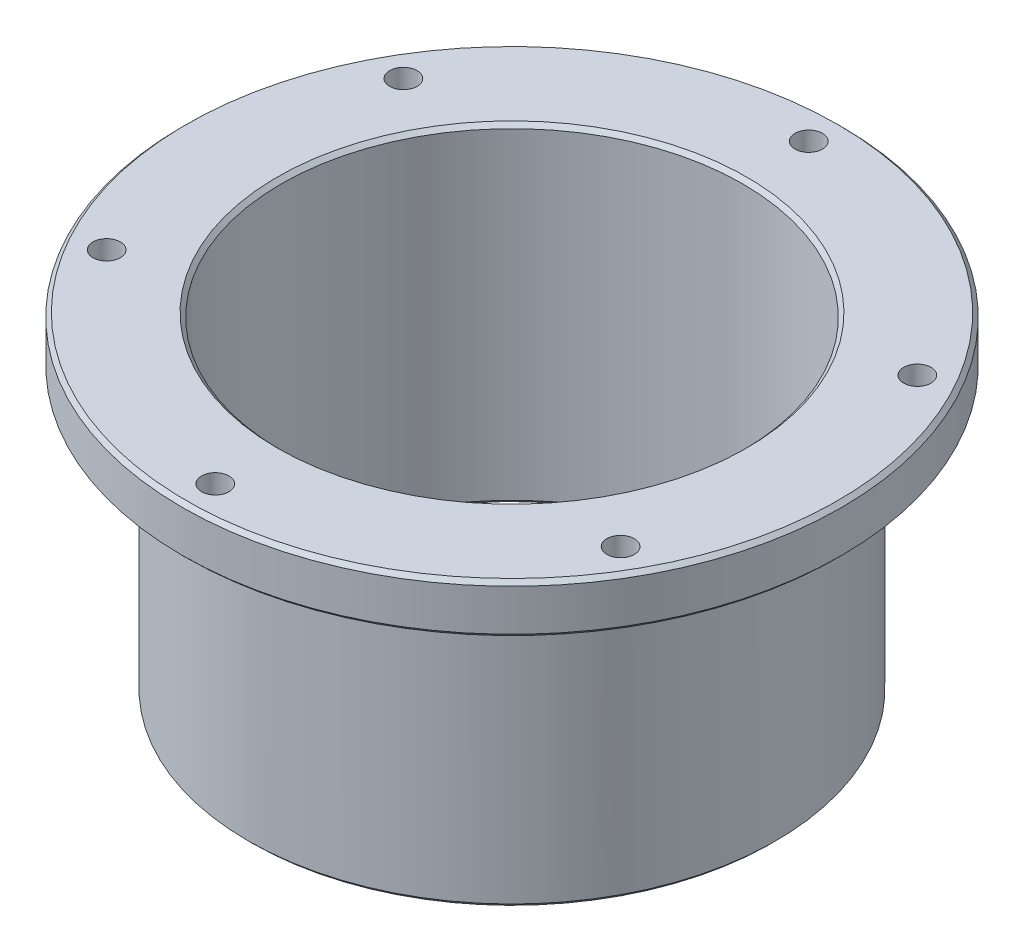
ISO-10303-21;
HEADER;
FILE_DESCRIPTION(('STEP AP214'),'2;1');
FILE_NAME('part.step','',(''),(''),'','','');
FILE_SCHEMA(('AUTOMOTIVE_DESIGN { 1 0 10303 214 1 1 1 1 }'));
ENDSEC;
DATA;
#1=APPLICATION_CONTEXT('core data for automotive mechanical design processes');
#2=APPLICATION_PROTOCOL_DEFINITION('international standard','automotive_design',2000,#1);
#3=PRODUCT_CONTEXT('',#1,'mechanical');
#4=PRODUCT('Part','Part','',(#3));
#5=PRODUCT_RELATED_PRODUCT_CATEGORY('part','',(#4));
#6=PRODUCT_DEFINITION_FORMATION('','',#4);
#7=PRODUCT_DEFINITION_CONTEXT('part definition',#1,'design');
#8=PRODUCT_DEFINITION('design','',#6,#7);
#9=PRODUCT_DEFINITION_SHAPE('','',#8);
#10=(LENGTH_UNIT() NAMED_UNIT(*) SI_UNIT(.MILLI.,.METRE.));
#11=(NAMED_UNIT(*) PLANE_ANGLE_UNIT() SI_UNIT($,.RADIAN.));
#12=(NAMED_UNIT(*) SI_UNIT($,.STERADIAN.) SOLID_ANGLE_UNIT());
#13=UNCERTAINTY_MEASURE_WITH_UNIT(LENGTH_MEASURE(1.E-05),#10,'distance_accuracy_value','');
#14=(GEOMETRIC_REPRESENTATION_CONTEXT(3) GLOBAL_UNCERTAINTY_ASSIGNED_CONTEXT((#13)) GLOBAL_UNIT_ASSIGNED_CONTEXT((#10,
#11,#12)) REPRESENTATION_CONTEXT('',''));
#15=CARTESIAN_POINT('',(0.,0.,0.));
#16=DIRECTION('',(0.,0.,1.));
#17=DIRECTION('',(1.,0.,0.));
#18=AXIS2_PLACEMENT_3D('',#15,#16,#17);
#19=CARTESIAN_POINT('',(-12.5758773367656,27.3684999999995,0.));
#20=DIRECTION('',(0.,1.,0.));
#21=DIRECTION('',(0.,0.,1.));
#22=AXIS2_PLACEMENT_3D('',#19,#20,#21);
#23=CONICAL_SURFACE('',#22,31.7500000000004,0.785398163399998);
#24=CARTESIAN_POINT('',(-12.5758773367656,27.3685,0.));
#25=DIRECTION('',(0.,-1.,0.));
#26=DIRECTION('',(0.,0.,-1.));
#27=AXIS2_PLACEMENT_3D('',#24,#25,#26);
#28=CIRCLE('',#27,31.75);
#29=CARTESIAN_POINT('',(-12.5758773367656,27.3685,-31.75));
#30=VERTEX_POINT('',#29);
#31=EDGE_CURVE('E50',#30,#30,#28,.F.);
#32=ORIENTED_EDGE('',*,*,#31,.F.);
#33=EDGE_LOOP('',(#32));
#34=FACE_BOUND('',#33,.T.);
#35=CARTESIAN_POINT('',(-12.5758773367656,26.9875000000004,0.));
#36=DIRECTION('',(0.,1.,0.));
#37=DIRECTION('',(0.,0.,1.));
#38=AXIS2_PLACEMENT_3D('',#35,#36,#37);
#39=CIRCLE('',#38,31.3689999999995);
#40=CARTESIAN_POINT('',(-12.5758773367656,26.9875000000004,31.3689999999995));
#41=VERTEX_POINT('',#40);
#42=EDGE_CURVE('E18',#41,#41,#39,.T.);
#43=ORIENTED_EDGE('',*,*,#42,.T.);
#44=EDGE_LOOP('',(#43));
#45=FACE_BOUND('',#44,.T.);
#46=ADVANCED_FACE('F15',(#34,#45),#23,.T.);
#47=CARTESIAN_POINT('',(-12.5758773367656,26.7335,0.));
#48=DIRECTION('',(0.,-1.,0.));
#49=DIRECTION('',(0.,0.,-1.));
#50=AXIS2_PLACEMENT_3D('',#47,#48,#49);
#51=TOROIDAL_SURFACE('',#50,25.654,0.254);
#52=CARTESIAN_POINT('',(-12.5758773367656,26.7335,0.));
#53=DIRECTION('',(0.,1.,0.));
#54=DIRECTION('',(0.,0.,1.));
#55=AXIS2_PLACEMENT_3D('',#52,#53,#54);
#56=CIRCLE('',#55,25.4);
#57=CARTESIAN_POINT('',(-12.5758773367656,26.7335,25.4));
#58=VERTEX_POINT('',#57);
#59=EDGE_CURVE('E46',#58,#58,#56,.F.);
#60=ORIENTED_EDGE('',*,*,#59,.F.);
#61=EDGE_LOOP('',(#60));
#62=FACE_BOUND('',#61,.T.);
#63=CARTESIAN_POINT('',(-12.5758773367656,26.9875,0.));
#64=DIRECTION('',(0.,-1.,0.));
#65=DIRECTION('',(1.,0.,0.));
#66=AXIS2_PLACEMENT_3D('',#63,#64,#65);
#67=CIRCLE('',#66,25.654);
#68=CARTESIAN_POINT('',(13.0781226632344,26.9875,0.));
#69=VERTEX_POINT('',#68);
#70=EDGE_CURVE('E55',#69,#69,#67,.T.);
#71=ORIENTED_EDGE('',*,*,#70,.T.);
#72=EDGE_LOOP('',(#71));
#73=FACE_BOUND('',#72,.T.);
#74=ADVANCED_FACE('F78',(#62,#73),#51,.F.);
#75=CARTESIAN_POINT('',(-12.5758773367656,26.9875,0.));
#76=DIRECTION('',(0.,1.,0.));
#77=DIRECTION('',(0.,0.,1.));
#78=AXIS2_PLACEMENT_3D('',#75,#76,#77);
#79=PLANE('',#78);
#80=ORIENTED_EDGE('',*,*,#70,.F.);
#81=EDGE_LOOP('',(#80));
#82=FACE_BOUND('',#81,.T.);
#83=ORIENTED_EDGE('',*,*,#42,.F.);
#84=EDGE_LOOP('',(#83));
#85=FACE_BOUND('',#84,.T.);
#86=CARTESIAN_POINT('',(-12.5758773367656,26.9875,-28.575));
#87=DIRECTION('',(0.,1.,0.));
#88=DIRECTION('',(0.,0.,1.));
#89=AXIS2_PLACEMENT_3D('',#86,#87,#88);
#90=CIRCLE('',#89,1.3208);
#91=CARTESIAN_POINT('',(-12.5758773367656,26.9875,-27.2542));
#92=VERTEX_POINT('',#91);
#93=EDGE_CURVE('E43',#92,#92,#90,.T.);
#94=ORIENTED_EDGE('',*,*,#93,.T.);
#95=EDGE_LOOP('',(#94));
#96=FACE_BOUND('',#95,.T.);
#97=CARTESIAN_POINT('',(12.1707985763747,26.9875,-14.2875));
#98=DIRECTION('',(0.,1.,0.));
#99=DIRECTION('',(0.,0.,1.));
#100=AXIS2_PLACEMENT_3D('',#97,#98,#99);
#101=CIRCLE('',#100,1.3208);
#102=CARTESIAN_POINT('',(12.1707985763747,26.9875,-12.9667));
#103=VERTEX_POINT('',#102);
#104=EDGE_CURVE('E122',#103,#103,#101,.T.);
#105=ORIENTED_EDGE('',*,*,#104,.T.);
#106=EDGE_LOOP('',(#105));
#107=FACE_BOUND('',#106,.T.);
#108=CARTESIAN_POINT('',(12.1707985763747,26.9875,14.2875));
#109=DIRECTION('',(0.,1.,0.));
#110=DIRECTION('',(0.,0.,1.));
#111=AXIS2_PLACEMENT_3D('',#108,#109,#110);
#112=CIRCLE('',#111,1.3208);
#113=CARTESIAN_POINT('',(12.1707985763747,26.9875,15.6083));
#114=VERTEX_POINT('',#113);
#115=EDGE_CURVE('E125',#114,#114,#112,.T.);
#116=ORIENTED_EDGE('',*,*,#115,.T.);
#117=EDGE_LOOP('',(#116));
#118=FACE_BOUND('',#117,.T.);
#119=CARTESIAN_POINT('',(-12.5758773367656,26.9875,28.575));
#120=DIRECTION('',(0.,1.,0.));
#121=DIRECTION('',(0.,0.,1.));
#122=AXIS2_PLACEMENT_3D('',#119,#120,#121);
#123=CIRCLE('',#122,1.3208);
#124=CARTESIAN_POINT('',(-12.5758773367656,26.9875,29.8958));
#125=VERTEX_POINT('',#124);
#126=EDGE_CURVE('E128',#125,#125,#123,.T.);
#127=ORIENTED_EDGE('',*,*,#126,.T.);
#128=EDGE_LOOP('',(#127));
#129=FACE_BOUND('',#128,.T.);
#130=CARTESIAN_POINT('',(-37.322553249906,26.9875,14.2875));
#131=DIRECTION('',(0.,1.,0.));
#132=DIRECTION('',(0.,0.,1.));
#133=AXIS2_PLACEMENT_3D('',#130,#131,#132);
#134=CIRCLE('',#133,1.3208);
#135=CARTESIAN_POINT('',(-37.322553249906,26.9875,15.6083));
#136=VERTEX_POINT('',#135);
#137=EDGE_CURVE('E131',#136,#136,#134,.T.);
#138=ORIENTED_EDGE('',*,*,#137,.T.);
#139=EDGE_LOOP('',(#138));
#140=FACE_BOUND('',#139,.T.);
#141=CARTESIAN_POINT('',(-37.322553249906,26.9875,-14.2875));
#142=DIRECTION('',(0.,1.,0.));
#143=DIRECTION('',(0.,0.,1.));
#144=AXIS2_PLACEMENT_3D('',#141,#142,#143);
#145=CIRCLE('',#144,1.3208);
#146=CARTESIAN_POINT('',(-37.322553249906,26.9875,-12.9667));
#147=VERTEX_POINT('',#146);
#148=EDGE_CURVE('E49',#147,#147,#145,.T.);
#149=ORIENTED_EDGE('',*,*,#148,.T.);
#150=EDGE_LOOP('',(#149));
#151=FACE_BOUND('',#150,.T.);
#152=ADVANCED_FACE('F68',(#82,#85,#96,#107,#118,#129,#140,#151),#79,.F.);
#153=CARTESIAN_POINT('',(-12.5758773367656,15.875,0.));
#154=DIRECTION('',(0.,-1.,0.));
#155=DIRECTION('',(0.,0.,-1.));
#156=AXIS2_PLACEMENT_3D('',#153,#154,#155);
#157=CYLINDRICAL_SURFACE('',#156,31.75);
#158=ORIENTED_EDGE('',*,*,#31,.T.);
#159=EDGE_LOOP('',(#158));
#160=FACE_BOUND('',#159,.T.);
#161=CARTESIAN_POINT('',(-12.5758773367656,31.3690000000005,0.));
#162=DIRECTION('',(0.,-1.,0.));
#163=DIRECTION('',(-1.,0.,0.));
#164=AXIS2_PLACEMENT_3D('',#161,#162,#163);
#165=CIRCLE('',#164,31.7500000000005);
#166=CARTESIAN_POINT('',(-44.3258773367661,31.3690000000005,0.));
#167=VERTEX_POINT('',#166);
#168=EDGE_CURVE('E38',#167,#167,#165,.F.);
#169=ORIENTED_EDGE('',*,*,#168,.F.);
#170=EDGE_LOOP('',(#169));
#171=FACE_BOUND('',#170,.T.);
#172=ADVANCED_FACE('F77',(#160,#171),#157,.T.);
#173=CARTESIAN_POINT('',(-12.5758773367656,0.,0.));
#174=DIRECTION('',(0.,1.,0.));
#175=DIRECTION('',(0.,0.,1.));
#176=AXIS2_PLACEMENT_3D('',#173,#174,#175);
#177=CYLINDRICAL_SURFACE('',#176,25.4);
#178=ORIENTED_EDGE('',*,*,#59,.T.);
#179=EDGE_LOOP('',(#178));
#180=FACE_BOUND('',#179,.T.);
#181=CARTESIAN_POINT('',(-12.5758773367656,0.380999999999514,0.));
#182=DIRECTION('',(0.,1.,0.));
#183=DIRECTION('',(-1.,0.,0.));
#184=AXIS2_PLACEMENT_3D('',#181,#182,#183);
#185=CIRCLE('',#184,25.4000000000005);
#186=CARTESIAN_POINT('',(-37.9758773367661,0.380999999999514,0.));
#187=VERTEX_POINT('',#186);
#188=EDGE_CURVE('E34',#187,#187,#185,.F.);
#189=ORIENTED_EDGE('',*,*,#188,.F.);
#190=EDGE_LOOP('',(#189));
#191=FACE_BOUND('',#190,.T.);
#192=ADVANCED_FACE('F140',(#180,#191),#177,.T.);
#193=CARTESIAN_POINT('',(-37.322553249906,-63.5,-14.2875));
#194=DIRECTION('',(0.,1.,0.));
#195=DIRECTION('',(0.,0.,1.));
#196=AXIS2_PLACEMENT_3D('',#193,#194,#195);
#197=CYLINDRICAL_SURFACE('',#196,1.3208);
#198=CARTESIAN_POINT('',(-37.322553249906,31.75,-14.2875));
#199=DIRECTION('',(0.,1.,0.));
#200=DIRECTION('',(0.,0.,1.));
#201=AXIS2_PLACEMENT_3D('',#198,#199,#200);
#202=CIRCLE('',#201,1.3208);
#203=CARTESIAN_POINT('',(-37.322553249906,31.75,-12.9667));
#204=VERTEX_POINT('',#203);
#205=EDGE_CURVE('E37',#204,#204,#202,.F.);
#206=ORIENTED_EDGE('',*,*,#205,.F.);
#207=EDGE_LOOP('',(#206));
#208=FACE_BOUND('',#207,.T.);
#209=ORIENTED_EDGE('',*,*,#148,.F.);
#210=EDGE_LOOP('',(#209));
#211=FACE_BOUND('',#210,.T.);
#212=ADVANCED_FACE('F137',(#208,#211),#197,.F.);
#213=CARTESIAN_POINT('',(-37.322553249906,-63.5,14.2875));
#214=DIRECTION('',(0.,1.,0.));
#215=DIRECTION('',(0.,0.,1.));
#216=AXIS2_PLACEMENT_3D('',#213,#214,#215);
#217=CYLINDRICAL_SURFACE('',#216,1.3208);
#218=CARTESIAN_POINT('',(-37.322553249906,31.75,14.2875));
#219=DIRECTION('',(0.,1.,0.));
#220=DIRECTION('',(0.,0.,1.));
#221=AXIS2_PLACEMENT_3D('',#218,#219,#220);
#222=CIRCLE('',#221,1.3208);
#223=CARTESIAN_POINT('',(-37.322553249906,31.75,15.6083));
#224=VERTEX_POINT('',#223);
#225=EDGE_CURVE('E115',#224,#224,#222,.F.);
#226=ORIENTED_EDGE('',*,*,#225,.F.);
#227=EDGE_LOOP('',(#226));
#228=FACE_BOUND('',#227,.T.);
#229=ORIENTED_EDGE('',*,*,#137,.F.);
#230=EDGE_LOOP('',(#229));
#231=FACE_BOUND('',#230,.T.);
#232=ADVANCED_FACE('F139',(#228,#231),#217,.F.);
#233=CARTESIAN_POINT('',(-12.5758773367656,-63.5,28.575));
#234=DIRECTION('',(0.,1.,0.));
#235=DIRECTION('',(0.,0.,1.));
#236=AXIS2_PLACEMENT_3D('',#233,#234,#235);
#237=CYLINDRICAL_SURFACE('',#236,1.3208);
#238=CARTESIAN_POINT('',(-12.5758773367656,31.75,28.575));
#239=DIRECTION('',(0.,1.,0.));
#240=DIRECTION('',(0.,0.,1.));
#241=AXIS2_PLACEMENT_3D('',#238,#239,#240);
#242=CIRCLE('',#241,1.3208);
#243=CARTESIAN_POINT('',(-12.5758773367656,31.75,29.8958));
#244=VERTEX_POINT('',#243);
#245=EDGE_CURVE('E112',#244,#244,#242,.F.);
#246=ORIENTED_EDGE('',*,*,#245,.F.);
#247=EDGE_LOOP('',(#246));
#248=FACE_BOUND('',#247,.T.);
#249=ORIENTED_EDGE('',*,*,#126,.F.);
#250=EDGE_LOOP('',(#249));
#251=FACE_BOUND('',#250,.T.);
#252=ADVANCED_FACE('F148',(#248,#251),#237,.F.);
#253=CARTESIAN_POINT('',(12.1707985763747,-63.5,14.2875));
#254=DIRECTION('',(0.,1.,0.));
#255=DIRECTION('',(0.,0.,1.));
#256=AXIS2_PLACEMENT_3D('',#253,#254,#255);
#257=CYLINDRICAL_SURFACE('',#256,1.3208);
#258=CARTESIAN_POINT('',(12.1707985763747,31.75,14.2875));
#259=DIRECTION('',(0.,1.,0.));
#260=DIRECTION('',(0.,0.,1.));
#261=AXIS2_PLACEMENT_3D('',#258,#259,#260);
#262=CIRCLE('',#261,1.3208);
#263=CARTESIAN_POINT('',(12.1707985763747,31.75,15.6083));
#264=VERTEX_POINT('',#263);
#265=EDGE_CURVE('E109',#264,#264,#262,.F.);
#266=ORIENTED_EDGE('',*,*,#265,.F.);
#267=EDGE_LOOP('',(#266));
#268=FACE_BOUND('',#267,.T.);
#269=ORIENTED_EDGE('',*,*,#115,.F.);
#270=EDGE_LOOP('',(#269));
#271=FACE_BOUND('',#270,.T.);
#272=ADVANCED_FACE('F191',(#268,#271),#257,.F.);
#273=CARTESIAN_POINT('',(12.1707985763747,-63.5,-14.2875));
#274=DIRECTION('',(0.,1.,0.));
#275=DIRECTION('',(0.,0.,1.));
#276=AXIS2_PLACEMENT_3D('',#273,#274,#275);
#277=CYLINDRICAL_SURFACE('',#276,1.3208);
#278=CARTESIAN_POINT('',(12.1707985763747,31.75,-14.2875));
#279=DIRECTION('',(0.,1.,0.));
#280=DIRECTION('',(0.,0.,1.));
#281=AXIS2_PLACEMENT_3D('',#278,#279,#280);
#282=CIRCLE('',#281,1.3208);
#283=CARTESIAN_POINT('',(12.1707985763747,31.75,-12.9667));
#284=VERTEX_POINT('',#283);
#285=EDGE_CURVE('E106',#284,#284,#282,.F.);
#286=ORIENTED_EDGE('',*,*,#285,.F.);
#287=EDGE_LOOP('',(#286));
#288=FACE_BOUND('',#287,.T.);
#289=ORIENTED_EDGE('',*,*,#104,.F.);
#290=EDGE_LOOP('',(#289));
#291=FACE_BOUND('',#290,.T.);
#292=ADVANCED_FACE('F187',(#288,#291),#277,.F.);
#293=CARTESIAN_POINT('',(-12.5758773367656,-63.5,-28.575));
#294=DIRECTION('',(0.,1.,0.));
#295=DIRECTION('',(0.,0.,1.));
#296=AXIS2_PLACEMENT_3D('',#293,#294,#295);
#297=CYLINDRICAL_SURFACE('',#296,1.3208);
#298=CARTESIAN_POINT('',(-12.5758773367656,31.75,-28.575));
#299=DIRECTION('',(0.,1.,0.));
#300=DIRECTION('',(0.,0.,1.));
#301=AXIS2_PLACEMENT_3D('',#298,#299,#300);
#302=CIRCLE('',#301,1.3208);
#303=CARTESIAN_POINT('',(-12.5758773367656,31.75,-27.2542));
#304=VERTEX_POINT('',#303);
#305=EDGE_CURVE('E103',#304,#304,#302,.F.);
#306=ORIENTED_EDGE('',*,*,#305,.F.);
#307=EDGE_LOOP('',(#306));
#308=FACE_BOUND('',#307,.T.);
#309=ORIENTED_EDGE('',*,*,#93,.F.);
#310=EDGE_LOOP('',(#309));
#311=FACE_BOUND('',#310,.T.);
#312=ADVANCED_FACE('F183',(#308,#311),#297,.F.);
#313=CARTESIAN_POINT('',(-12.5758773367656,31.3690000000005,0.));
#314=DIRECTION('',(0.,-1.,0.));
#315=DIRECTION('',(0.,0.,-1.));
#316=AXIS2_PLACEMENT_3D('',#313,#314,#315);
#317=CONICAL_SURFACE('',#316,31.7500000000005,0.785398163400007);
#318=ORIENTED_EDGE('',*,*,#168,.T.);
#319=EDGE_LOOP('',(#318));
#320=FACE_BOUND('',#319,.T.);
#321=CARTESIAN_POINT('',(-12.5758773367656,31.7499999999995,0.));
#322=DIRECTION('',(0.,-1.,0.));
#323=DIRECTION('',(0.,0.,-1.));
#324=AXIS2_PLACEMENT_3D('',#321,#322,#323);
#325=CIRCLE('',#324,31.3689999999995);
#326=CARTESIAN_POINT('',(-12.5758773367656,31.7499999999995,-31.3689999999995));
#327=VERTEX_POINT('',#326);
#328=EDGE_CURVE('E100',#327,#327,#325,.F.);
#329=ORIENTED_EDGE('',*,*,#328,.F.);
#330=EDGE_LOOP('',(#329));
#331=FACE_BOUND('',#330,.T.);
#332=ADVANCED_FACE('F179',(#320,#331),#317,.T.);
#333=CARTESIAN_POINT('',(-12.5758773367656,0.380999999999512,0.));
#334=DIRECTION('',(0.,1.,0.));
#335=DIRECTION('',(0.,0.,1.));
#336=AXIS2_PLACEMENT_3D('',#333,#334,#335);
#337=CONICAL_SURFACE('',#336,25.4000000000005,0.785398163399999);
#338=CARTESIAN_POINT('',(-12.5758773367656,4.84150480123402E-13,0.));
#339=DIRECTION('',(0.,1.,0.));
#340=DIRECTION('',(0.,0.,1.));
#341=AXIS2_PLACEMENT_3D('',#338,#339,#340);
#342=CIRCLE('',#341,25.0189999999995);
#343=CARTESIAN_POINT('',(-12.5758773367656,4.84123781644905E-13,25.0189999999995));
#344=VERTEX_POINT('',#343);
#345=EDGE_CURVE('E97',#344,#344,#342,.F.);
#346=ORIENTED_EDGE('',*,*,#345,.F.);
#347=EDGE_LOOP('',(#346));
#348=FACE_BOUND('',#347,.T.);
#349=ORIENTED_EDGE('',*,*,#188,.T.);
#350=EDGE_LOOP('',(#349));
#351=FACE_BOUND('',#350,.T.);
#352=ADVANCED_FACE('F175',(#348,#351),#337,.T.);
#353=CARTESIAN_POINT('',(14.4116226632344,31.75,0.));
#354=DIRECTION('',(0.,1.,0.));
#355=DIRECTION('',(0.,0.,1.));
#356=AXIS2_PLACEMENT_3D('',#353,#354,#355);
#357=PLANE('',#356);
#358=CARTESIAN_POINT('',(-12.5758773367656,31.7499999999995,0.));
#359=DIRECTION('',(0.,1.,0.));
#360=DIRECTION('',(0.,0.,1.));
#361=AXIS2_PLACEMENT_3D('',#358,#359,#360);
#362=CIRCLE('',#361,22.6060000000005);
#363=CARTESIAN_POINT('',(-12.5758773367656,31.7499999999995,22.6060000000005));
#364=VERTEX_POINT('',#363);
#365=EDGE_CURVE('E94',#364,#364,#362,.F.);
#366=ORIENTED_EDGE('',*,*,#365,.T.);
#367=EDGE_LOOP('',(#366));
#368=FACE_BOUND('',#367,.T.);
#369=ORIENTED_EDGE('',*,*,#328,.T.);
#370=EDGE_LOOP('',(#369));
#371=FACE_BOUND('',#370,.T.);
#372=ORIENTED_EDGE('',*,*,#305,.T.);
#373=EDGE_LOOP('',(#372));
#374=FACE_BOUND('',#373,.T.);
#375=ORIENTED_EDGE('',*,*,#285,.T.);
#376=EDGE_LOOP('',(#375));
#377=FACE_BOUND('',#376,.T.);
#378=ORIENTED_EDGE('',*,*,#265,.T.);
#379=EDGE_LOOP('',(#378));
#380=FACE_BOUND('',#379,.T.);
#381=ORIENTED_EDGE('',*,*,#245,.T.);
#382=EDGE_LOOP('',(#381));
#383=FACE_BOUND('',#382,.T.);
#384=ORIENTED_EDGE('',*,*,#225,.T.);
#385=EDGE_LOOP('',(#384));
#386=FACE_BOUND('',#385,.T.);
#387=ORIENTED_EDGE('',*,*,#205,.T.);
#388=EDGE_LOOP('',(#387));
#389=FACE_BOUND('',#388,.T.);
#390=ADVANCED_FACE('F171',(#368,#371,#374,#377,#380,#383,#386,#389),#357,.T.);
#391=CARTESIAN_POINT('',(14.4116226632344,0.,0.));
#392=DIRECTION('',(0.,-1.,0.));
#393=DIRECTION('',(0.,0.,-1.));
#394=AXIS2_PLACEMENT_3D('',#391,#392,#393);
#395=PLANE('',#394);
#396=ORIENTED_EDGE('',*,*,#345,.T.);
#397=EDGE_LOOP('',(#396));
#398=FACE_BOUND('',#397,.T.);
#399=CARTESIAN_POINT('',(-12.5758773367656,4.84014954851841E-13,0.));
#400=DIRECTION('',(0.,-1.,0.));
#401=DIRECTION('',(0.,0.,-1.));
#402=AXIS2_PLACEMENT_3D('',#399,#400,#401);
#403=CIRCLE('',#402,22.6060000000005);
#404=CARTESIAN_POINT('',(-12.5758773367656,4.84014954851841E-13,-22.6060000000005));
#405=VERTEX_POINT('',#404);
#406=EDGE_CURVE('E27',#405,#405,#403,.F.);
#407=ORIENTED_EDGE('',*,*,#406,.T.);
#408=EDGE_LOOP('',(#407));
#409=FACE_BOUND('',#408,.T.);
#410=ADVANCED_FACE('F167',(#398,#409),#395,.T.);
#411=CARTESIAN_POINT('',(-12.5758773367656,31.7499999999995,0.));
#412=DIRECTION('',(0.,1.,0.));
#413=DIRECTION('',(0.,0.,1.));
#414=AXIS2_PLACEMENT_3D('',#411,#412,#413);
#415=CONICAL_SURFACE('',#414,22.6060000000005,0.785398163399998);
#416=ORIENTED_EDGE('',*,*,#365,.F.);
#417=EDGE_LOOP('',(#416));
#418=FACE_BOUND('',#417,.T.);
#419=CARTESIAN_POINT('',(-12.5758773367656,31.369,0.));
#420=DIRECTION('',(0.,-1.,0.));
#421=DIRECTION('',(0.,0.,-1.));
#422=AXIS2_PLACEMENT_3D('',#419,#420,#421);
#423=CIRCLE('',#422,22.225);
#424=CARTESIAN_POINT('',(-12.5758773367656,31.369,-22.225));
#425=VERTEX_POINT('',#424);
#426=EDGE_CURVE('E22',#425,#425,#423,.T.);
#427=ORIENTED_EDGE('',*,*,#426,.T.);
#428=EDGE_LOOP('',(#427));
#429=FACE_BOUND('',#428,.T.);
#430=ADVANCED_FACE('F161',(#418,#429),#415,.F.);
#431=CARTESIAN_POINT('',(-12.5758773367656,4.84014954851841E-13,0.));
#432=DIRECTION('',(0.,-1.,0.));
#433=DIRECTION('',(0.,0.,-1.));
#434=AXIS2_PLACEMENT_3D('',#431,#432,#433);
#435=CONICAL_SURFACE('',#434,22.6060000000005,0.7853981634);
#436=CARTESIAN_POINT('',(-12.5758773367656,0.380999999999999,0.));
#437=DIRECTION('',(0.,-1.,0.));
#438=DIRECTION('',(0.,0.,-1.));
#439=AXIS2_PLACEMENT_3D('',#436,#437,#438);
#440=CIRCLE('',#439,22.225);
#441=CARTESIAN_POINT('',(-12.5758773367656,0.380999999999999,-22.225));
#442=VERTEX_POINT('',#441);
#443=EDGE_CURVE('E10',#442,#442,#440,.F.);
#444=ORIENTED_EDGE('',*,*,#443,.T.);
#445=EDGE_LOOP('',(#444));
#446=FACE_BOUND('',#445,.T.);
#447=ORIENTED_EDGE('',*,*,#406,.F.);
#448=EDGE_LOOP('',(#447));
#449=FACE_BOUND('',#448,.T.);
#450=ADVANCED_FACE('F155',(#446,#449),#435,.F.);
#451=CARTESIAN_POINT('',(-12.5758773367656,15.875,0.));
#452=DIRECTION('',(0.,-1.,0.));
#453=DIRECTION('',(0.,0.,-1.));
#454=AXIS2_PLACEMENT_3D('',#451,#452,#453);
#455=CYLINDRICAL_SURFACE('',#454,22.225);
#456=ORIENTED_EDGE('',*,*,#443,.F.);
#457=EDGE_LOOP('',(#456));
#458=FACE_BOUND('',#457,.T.);
#459=ORIENTED_EDGE('',*,*,#426,.F.);
#460=EDGE_LOOP('',(#459));
#461=FACE_BOUND('',#460,.T.);
#462=ADVANCED_FACE('F153',(#458,#461),#455,.F.);
#463=CLOSED_SHELL('',(#46,#74,#152,#172,#192,#212,#232,#252,#272,#292,#312,#332,#352,#390,#410,
#430,#450,#462));
#464=MANIFOLD_SOLID_BREP('B1',#463);
#465=ADVANCED_BREP_SHAPE_REPRESENTATION('',(#18,#464),#14);
#466=SHAPE_DEFINITION_REPRESENTATION(#9,#465);
ENDSEC;
END-ISO-10303-21;
